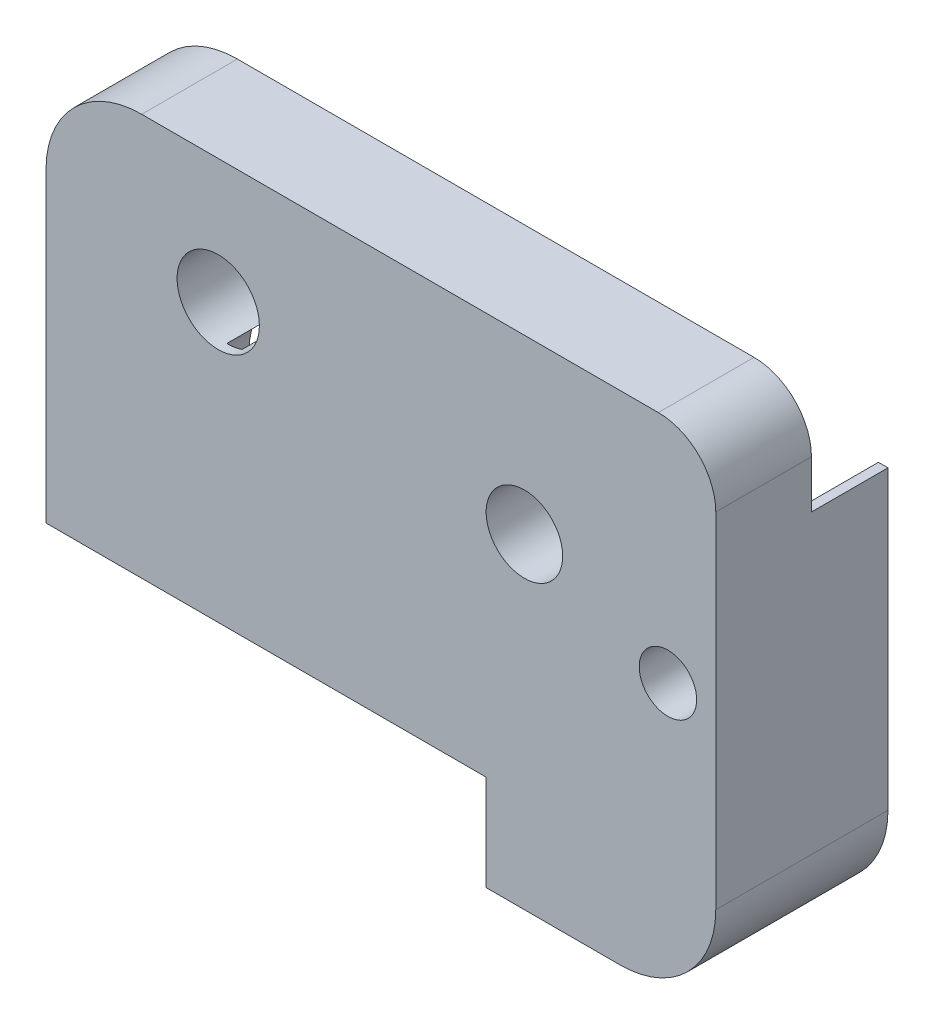
ISO-10303-21;
HEADER;
FILE_DESCRIPTION(('STEP AP214'),'2;1');
FILE_NAME('part.step','',(''),(''),'','','');
FILE_SCHEMA(('AUTOMOTIVE_DESIGN { 1 0 10303 214 1 1 1 1 }'));
ENDSEC;
DATA;
#1=APPLICATION_CONTEXT('core data for automotive mechanical design processes');
#2=APPLICATION_PROTOCOL_DEFINITION('international standard','automotive_design',2000,#1);
#3=PRODUCT_CONTEXT('',#1,'mechanical');
#4=PRODUCT('Part','Part','',(#3));
#5=PRODUCT_RELATED_PRODUCT_CATEGORY('part','',(#4));
#6=PRODUCT_DEFINITION_FORMATION('','',#4);
#7=PRODUCT_DEFINITION_CONTEXT('part definition',#1,'design');
#8=PRODUCT_DEFINITION('design','',#6,#7);
#9=PRODUCT_DEFINITION_SHAPE('','',#8);
#10=(LENGTH_UNIT() NAMED_UNIT(*) SI_UNIT(.MILLI.,.METRE.));
#11=(NAMED_UNIT(*) PLANE_ANGLE_UNIT() SI_UNIT($,.RADIAN.));
#12=(NAMED_UNIT(*) SI_UNIT($,.STERADIAN.) SOLID_ANGLE_UNIT());
#13=UNCERTAINTY_MEASURE_WITH_UNIT(LENGTH_MEASURE(1.E-05),#10,'distance_accuracy_value','');
#14=(GEOMETRIC_REPRESENTATION_CONTEXT(3) GLOBAL_UNCERTAINTY_ASSIGNED_CONTEXT((#13)) GLOBAL_UNIT_ASSIGNED_CONTEXT((#10,
#11,#12)) REPRESENTATION_CONTEXT('',''));
#15=CARTESIAN_POINT('',(0.,0.,0.));
#16=DIRECTION('',(0.,0.,1.));
#17=DIRECTION('',(1.,0.,0.));
#18=AXIS2_PLACEMENT_3D('',#15,#16,#17);
#19=CARTESIAN_POINT('',(-15.,-14.5,0.));
#20=DIRECTION('',(0.,0.,1.));
#21=DIRECTION('',(1.,0.,0.));
#22=AXIS2_PLACEMENT_3D('',#19,#20,#21);
#23=PLANE('',#22);
#24=CARTESIAN_POINT('',(17.5,-5.5,0.));
#25=DIRECTION('',(0.,0.,1.));
#26=DIRECTION('',(1.,0.,0.));
#27=AXIS2_PLACEMENT_3D('',#24,#25,#26);
#28=CIRCLE('',#27,2.);
#29=CARTESIAN_POINT('',(19.5,-5.5,0.));
#30=VERTEX_POINT('',#29);
#31=CARTESIAN_POINT('',(17.5,-7.5,0.));
#32=VERTEX_POINT('',#31);
#33=EDGE_CURVE('E220',#30,#32,#28,.F.);
#34=ORIENTED_EDGE('',*,*,#33,.T.);
#35=CARTESIAN_POINT('',(17.5,-5.5,0.));
#36=DIRECTION('',(0.,0.,1.));
#37=DIRECTION('',(1.,0.,0.));
#38=AXIS2_PLACEMENT_3D('',#35,#36,#37);
#39=CIRCLE('',#38,2.);
#40=CARTESIAN_POINT('',(15.5,-5.5,0.));
#41=VERTEX_POINT('',#40);
#42=EDGE_CURVE('E222',#32,#41,#39,.F.);
#43=ORIENTED_EDGE('',*,*,#42,.T.);
#44=DIRECTION('',(0.,1.,0.));
#45=VECTOR('',#44,1.);
#46=CARTESIAN_POINT('',(15.5,-7.5,0.));
#47=LINE('',#46,#45);
#48=CARTESIAN_POINT('',(15.5,-0.949192546583853,0.));
#49=VERTEX_POINT('',#48);
#50=EDGE_CURVE('E232',#41,#49,#47,.T.);
#51=ORIENTED_EDGE('',*,*,#50,.T.);
#52=DIRECTION('',(0.8001192566292,0.599840958230711,0.));
#53=VECTOR('',#52,1.);
#54=CARTESIAN_POINT('',(18.1,1.,0.));
#55=LINE('',#54,#53);
#56=CARTESIAN_POINT('',(2.,-11.07,0.));
#57=VERTEX_POINT('',#56);
#58=EDGE_CURVE('E202',#57,#49,#55,.T.);
#59=ORIENTED_EDGE('',*,*,#58,.F.);
#60=DIRECTION('',(0.,1.,0.));
#61=VECTOR('',#60,1.);
#62=CARTESIAN_POINT('',(2.,-11.07,0.));
#63=LINE('',#62,#61);
#64=CARTESIAN_POINT('',(2.,-14.5,0.));
#65=VERTEX_POINT('',#64);
#66=EDGE_CURVE('E206',#65,#57,#63,.T.);
#67=ORIENTED_EDGE('',*,*,#66,.F.);
#68=DIRECTION('',(1.,0.,0.));
#69=VECTOR('',#68,1.);
#70=CARTESIAN_POINT('',(-15.,-14.5,0.));
#71=LINE('',#70,#69);
#72=CARTESIAN_POINT('',(-15.,-14.5,0.));
#73=VERTEX_POINT('',#72);
#74=EDGE_CURVE('E268',#73,#65,#71,.T.);
#75=ORIENTED_EDGE('',*,*,#74,.F.);
#76=DIRECTION('',(0.,-1.,0.));
#77=VECTOR('',#76,1.);
#78=CARTESIAN_POINT('',(-15.,6.5,0.));
#79=LINE('',#78,#77);
#80=CARTESIAN_POINT('',(-15.,1.5,0.));
#81=VERTEX_POINT('',#80);
#82=EDGE_CURVE('E277',#81,#73,#79,.T.);
#83=ORIENTED_EDGE('',*,*,#82,.F.);
#84=CARTESIAN_POINT('',(-10.,1.5,0.));
#85=DIRECTION('',(0.,0.,1.));
#86=DIRECTION('',(1.,0.,0.));
#87=AXIS2_PLACEMENT_3D('',#84,#85,#86);
#88=CIRCLE('',#87,5.);
#89=CARTESIAN_POINT('',(-10.,6.5,0.));
#90=VERTEX_POINT('',#89);
#91=EDGE_CURVE('E305',#81,#90,#88,.F.);
#92=ORIENTED_EDGE('',*,*,#91,.T.);
#93=DIRECTION('',(-1.,0.,0.));
#94=VECTOR('',#93,1.);
#95=CARTESIAN_POINT('',(-15.,6.5,0.));
#96=LINE('',#95,#94);
#97=CARTESIAN_POINT('',(17.,6.5,0.));
#98=VERTEX_POINT('',#97);
#99=EDGE_CURVE('E276',#98,#90,#96,.T.);
#100=ORIENTED_EDGE('',*,*,#99,.F.);
#101=CARTESIAN_POINT('',(17.,3.5,0.));
#102=DIRECTION('',(0.,0.,1.));
#103=DIRECTION('',(1.,0.,0.));
#104=AXIS2_PLACEMENT_3D('',#101,#102,#103);
#105=CIRCLE('',#104,3.);
#106=CARTESIAN_POINT('',(20.,3.5,0.));
#107=VERTEX_POINT('',#106);
#108=EDGE_CURVE('E355',#98,#107,#105,.F.);
#109=ORIENTED_EDGE('',*,*,#108,.T.);
#110=DIRECTION('',(0.,-1.,0.));
#111=VECTOR('',#110,1.);
#112=CARTESIAN_POINT('',(20.,6.5,0.));
#113=LINE('',#112,#111);
#114=CARTESIAN_POINT('',(20.,1.,0.));
#115=VERTEX_POINT('',#114);
#116=EDGE_CURVE('E358',#107,#115,#113,.T.);
#117=ORIENTED_EDGE('',*,*,#116,.T.);
#118=DIRECTION('',(1.,0.,0.));
#119=VECTOR('',#118,1.);
#120=CARTESIAN_POINT('',(20.,1.,0.));
#121=LINE('',#120,#119);
#122=CARTESIAN_POINT('',(19.5,1.,0.));
#123=VERTEX_POINT('',#122);
#124=EDGE_CURVE('E205',#123,#115,#121,.T.);
#125=ORIENTED_EDGE('',*,*,#124,.F.);
#126=DIRECTION('',(0.,-1.,0.));
#127=VECTOR('',#126,1.);
#128=CARTESIAN_POINT('',(19.5,1.,0.));
#129=LINE('',#128,#127);
#130=EDGE_CURVE('E174',#123,#30,#129,.T.);
#131=ORIENTED_EDGE('',*,*,#130,.T.);
#132=EDGE_LOOP('',(#34,#43,#51,#59,#67,#75,#83,#92,#100,#109,#117,#125,#131));
#133=FACE_BOUND('',#132,.T.);
#134=CARTESIAN_POINT('',(-4.9,-6.5,0.));
#135=DIRECTION('',(0.,0.,-1.));
#136=DIRECTION('',(-1.,0.,0.));
#137=AXIS2_PLACEMENT_3D('',#134,#135,#136);
#138=CIRCLE('',#137,4.5);
#139=CARTESIAN_POINT('',(-9.4,-6.5,0.));
#140=VERTEX_POINT('',#139);
#141=EDGE_CURVE('E380',#140,#140,#138,.T.);
#142=ORIENTED_EDGE('',*,*,#141,.F.);
#143=EDGE_LOOP('',(#142));
#144=FACE_BOUND('',#143,.T.);
#145=CARTESIAN_POINT('',(17.5,-5.5,0.));
#146=DIRECTION('',(0.,0.,1.));
#147=DIRECTION('',(1.,0.,0.));
#148=AXIS2_PLACEMENT_3D('',#145,#146,#147);
#149=CIRCLE('',#148,1.5);
#150=CARTESIAN_POINT('',(19.,-5.5,0.));
#151=VERTEX_POINT('',#150);
#152=EDGE_CURVE('E178',#151,#151,#149,.F.);
#153=ORIENTED_EDGE('',*,*,#152,.F.);
#154=EDGE_LOOP('',(#153));
#155=FACE_BOUND('',#154,.T.);
#156=ADVANCED_FACE('F36',(#133,#144,#155),#23,.F.);
#157=CARTESIAN_POINT('',(-15.,6.5,5.));
#158=DIRECTION('',(1.,0.,0.));
#159=DIRECTION('',(0.,1.,0.));
#160=AXIS2_PLACEMENT_3D('',#157,#158,#159);
#161=PLANE('',#160);
#162=DIRECTION('',(0.,-1.,0.));
#163=VECTOR('',#162,1.);
#164=CARTESIAN_POINT('',(-15.,6.5,5.));
#165=LINE('',#164,#163);
#166=CARTESIAN_POINT('',(-15.,1.5,5.));
#167=VERTEX_POINT('',#166);
#168=CARTESIAN_POINT('',(-15.,-14.5,5.));
#169=VERTEX_POINT('',#168);
#170=EDGE_CURVE('E330',#167,#169,#165,.T.);
#171=ORIENTED_EDGE('',*,*,#170,.F.);
#172=DIRECTION('',(0.,0.,-1.));
#173=VECTOR('',#172,1.);
#174=CARTESIAN_POINT('',(-15.,1.5,5.));
#175=LINE('',#174,#173);
#176=EDGE_CURVE('E303',#167,#81,#175,.T.);
#177=ORIENTED_EDGE('',*,*,#176,.T.);
#178=ORIENTED_EDGE('',*,*,#82,.T.);
#179=DIRECTION('',(0.,0.,-1.));
#180=VECTOR('',#179,1.);
#181=CARTESIAN_POINT('',(-15.,-14.5,5.));
#182=LINE('',#181,#180);
#183=EDGE_CURVE('E275',#169,#73,#182,.T.);
#184=ORIENTED_EDGE('',*,*,#183,.F.);
#185=EDGE_LOOP('',(#171,#177,#178,#184));
#186=FACE_BOUND('',#185,.T.);
#187=ADVANCED_FACE('F329',(#186),#161,.F.);
#188=CARTESIAN_POINT('',(-15.,-14.5,5.));
#189=DIRECTION('',(0.,1.,0.));
#190=DIRECTION('',(0.,0.,1.));
#191=AXIS2_PLACEMENT_3D('',#188,#189,#190);
#192=PLANE('',#191);
#193=CARTESIAN_POINT('',(1.40000000000001,-14.5,2.5));
#194=DIRECTION('',(0.,-1.,0.));
#195=DIRECTION('',(0.,0.,-1.));
#196=AXIS2_PLACEMENT_3D('',#193,#194,#195);
#197=CIRCLE('',#196,1.25);
#198=CARTESIAN_POINT('',(1.40000000000001,-14.5,1.25));
#199=VERTEX_POINT('',#198);
#200=EDGE_CURVE('E360',#199,#199,#197,.T.);
#201=ORIENTED_EDGE('',*,*,#200,.F.);
#202=EDGE_LOOP('',(#201));
#203=FACE_BOUND('',#202,.T.);
#204=CARTESIAN_POINT('',(-12.,-14.5,2.5));
#205=DIRECTION('',(0.,-1.,0.));
#206=DIRECTION('',(0.,0.,-1.));
#207=AXIS2_PLACEMENT_3D('',#204,#205,#206);
#208=CIRCLE('',#207,1.25);
#209=CARTESIAN_POINT('',(-12.,-14.5,1.25));
#210=VERTEX_POINT('',#209);
#211=EDGE_CURVE('E377',#210,#210,#208,.T.);
#212=ORIENTED_EDGE('',*,*,#211,.F.);
#213=EDGE_LOOP('',(#212));
#214=FACE_BOUND('',#213,.T.);
#215=ORIENTED_EDGE('',*,*,#74,.T.);
#216=DIRECTION('',(0.,0.,1.));
#217=VECTOR('',#216,1.);
#218=CARTESIAN_POINT('',(2.,-14.5,-4.));
#219=LINE('',#218,#217);
#220=CARTESIAN_POINT('',(2.,-14.5,-4.));
#221=VERTEX_POINT('',#220);
#222=EDGE_CURVE('E263',#221,#65,#219,.T.);
#223=ORIENTED_EDGE('',*,*,#222,.F.);
#224=DIRECTION('',(-1.,0.,0.));
#225=VECTOR('',#224,1.);
#226=CARTESIAN_POINT('',(2.,-14.5,-4.));
#227=LINE('',#226,#225);
#228=CARTESIAN_POINT('',(8.,-14.5,-4.));
#229=VERTEX_POINT('',#228);
#230=EDGE_CURVE('E251',#229,#221,#227,.T.);
#231=ORIENTED_EDGE('',*,*,#230,.F.);
#232=DIRECTION('',(0.,0.,-1.));
#233=VECTOR('',#232,1.);
#234=CARTESIAN_POINT('',(8.00000000000001,-14.5,5.));
#235=LINE('',#234,#233);
#236=CARTESIAN_POINT('',(8.00000000000001,-14.5,5.));
#237=VERTEX_POINT('',#236);
#238=EDGE_CURVE('E323',#237,#229,#235,.T.);
#239=ORIENTED_EDGE('',*,*,#238,.F.);
#240=DIRECTION('',(1.,0.,0.));
#241=VECTOR('',#240,1.);
#242=CARTESIAN_POINT('',(-15.,-14.5,5.));
#243=LINE('',#242,#241);
#244=EDGE_CURVE('E324',#169,#237,#243,.T.);
#245=ORIENTED_EDGE('',*,*,#244,.F.);
#246=ORIENTED_EDGE('',*,*,#183,.T.);
#247=EDGE_LOOP('',(#215,#223,#231,#239,#245,#246));
#248=FACE_BOUND('',#247,.T.);
#249=ADVANCED_FACE('F272',(#203,#214,#248),#192,.F.);
#250=CARTESIAN_POINT('',(-15.,6.5,5.));
#251=DIRECTION('',(0.,-1.,0.));
#252=DIRECTION('',(0.,0.,-1.));
#253=AXIS2_PLACEMENT_3D('',#250,#251,#252);
#254=PLANE('',#253);
#255=ORIENTED_EDGE('',*,*,#99,.T.);
#256=DIRECTION('',(0.,0.,-1.));
#257=VECTOR('',#256,1.);
#258=CARTESIAN_POINT('',(-10.,6.5,5.));
#259=LINE('',#258,#257);
#260=CARTESIAN_POINT('',(-10.,6.5,5.));
#261=VERTEX_POINT('',#260);
#262=EDGE_CURVE('E215',#90,#261,#259,.F.);
#263=ORIENTED_EDGE('',*,*,#262,.T.);
#264=DIRECTION('',(-1.,0.,0.));
#265=VECTOR('',#264,1.);
#266=CARTESIAN_POINT('',(-15.,6.5,5.));
#267=LINE('',#266,#265);
#268=CARTESIAN_POINT('',(17.,6.5,5.));
#269=VERTEX_POINT('',#268);
#270=EDGE_CURVE('E313',#269,#261,#267,.T.);
#271=ORIENTED_EDGE('',*,*,#270,.F.);
#272=DIRECTION('',(0.,0.,1.));
#273=VECTOR('',#272,1.);
#274=CARTESIAN_POINT('',(17.,6.5,0.));
#275=LINE('',#274,#273);
#276=EDGE_CURVE('E295',#269,#98,#275,.F.);
#277=ORIENTED_EDGE('',*,*,#276,.T.);
#278=EDGE_LOOP('',(#255,#263,#271,#277));
#279=FACE_BOUND('',#278,.T.);
#280=ADVANCED_FACE('F312',(#279),#254,.F.);
#281=CARTESIAN_POINT('',(-15.,-14.5,5.));
#282=DIRECTION('',(0.,0.,1.));
#283=DIRECTION('',(1.,0.,0.));
#284=AXIS2_PLACEMENT_3D('',#281,#282,#283);
#285=PLANE('',#284);
#286=CARTESIAN_POINT('',(10.,-2.5,5.));
#287=DIRECTION('',(0.,0.,1.));
#288=DIRECTION('',(1.,0.,0.));
#289=AXIS2_PLACEMENT_3D('',#286,#287,#288);
#290=CIRCLE('',#289,2.);
#291=CARTESIAN_POINT('',(12.,-2.5,5.));
#292=VERTEX_POINT('',#291);
#293=EDGE_CURVE('E513',#292,#292,#290,.T.);
#294=ORIENTED_EDGE('',*,*,#293,.F.);
#295=EDGE_LOOP('',(#294));
#296=FACE_BOUND('',#295,.T.);
#297=CARTESIAN_POINT('',(17.5,-5.5,5.));
#298=DIRECTION('',(0.,0.,1.));
#299=DIRECTION('',(1.,0.,0.));
#300=AXIS2_PLACEMENT_3D('',#297,#298,#299);
#301=CIRCLE('',#300,1.5);
#302=CARTESIAN_POINT('',(19.,-5.5,5.));
#303=VERTEX_POINT('',#302);
#304=EDGE_CURVE('E365',#303,#303,#301,.T.);
#305=ORIENTED_EDGE('',*,*,#304,.F.);
#306=EDGE_LOOP('',(#305));
#307=FACE_BOUND('',#306,.T.);
#308=CARTESIAN_POINT('',(-6.,0.,5.));
#309=DIRECTION('',(0.,0.,1.));
#310=DIRECTION('',(1.,0.,0.));
#311=AXIS2_PLACEMENT_3D('',#308,#309,#310);
#312=CIRCLE('',#311,2.15);
#313=CARTESIAN_POINT('',(-3.85,0.,5.));
#314=VERTEX_POINT('',#313);
#315=EDGE_CURVE('E334',#314,#314,#312,.T.);
#316=ORIENTED_EDGE('',*,*,#315,.F.);
#317=EDGE_LOOP('',(#316));
#318=FACE_BOUND('',#317,.T.);
#319=DIRECTION('',(1.,0.,0.));
#320=VECTOR('',#319,1.);
#321=CARTESIAN_POINT('',(8.,-19.5,5.));
#322=LINE('',#321,#320);
#323=CARTESIAN_POINT('',(8.,-19.5,5.));
#324=VERTEX_POINT('',#323);
#325=CARTESIAN_POINT('',(15.,-19.5,5.));
#326=VERTEX_POINT('',#325);
#327=EDGE_CURVE('E369',#324,#326,#322,.T.);
#328=ORIENTED_EDGE('',*,*,#327,.T.);
#329=CARTESIAN_POINT('',(15.,-14.5,5.));
#330=DIRECTION('',(0.,0.,1.));
#331=DIRECTION('',(1.,0.,0.));
#332=AXIS2_PLACEMENT_3D('',#329,#330,#331);
#333=CIRCLE('',#332,5.);
#334=CARTESIAN_POINT('',(20.,-14.5,5.));
#335=VERTEX_POINT('',#334);
#336=EDGE_CURVE('E297',#326,#335,#333,.T.);
#337=ORIENTED_EDGE('',*,*,#336,.T.);
#338=DIRECTION('',(0.,1.,0.));
#339=VECTOR('',#338,1.);
#340=CARTESIAN_POINT('',(20.,6.5,5.));
#341=LINE('',#340,#339);
#342=CARTESIAN_POINT('',(20.,3.5,5.));
#343=VERTEX_POINT('',#342);
#344=EDGE_CURVE('E739',#335,#343,#341,.T.);
#345=ORIENTED_EDGE('',*,*,#344,.T.);
#346=CARTESIAN_POINT('',(17.,3.5,5.));
#347=DIRECTION('',(0.,0.,1.));
#348=DIRECTION('',(1.,0.,0.));
#349=AXIS2_PLACEMENT_3D('',#346,#347,#348);
#350=CIRCLE('',#349,3.);
#351=EDGE_CURVE('E322',#343,#269,#350,.T.);
#352=ORIENTED_EDGE('',*,*,#351,.T.);
#353=ORIENTED_EDGE('',*,*,#270,.T.);
#354=CARTESIAN_POINT('',(-10.,1.5,5.));
#355=DIRECTION('',(0.,0.,1.));
#356=DIRECTION('',(1.,0.,0.));
#357=AXIS2_PLACEMENT_3D('',#354,#355,#356);
#358=CIRCLE('',#357,5.);
#359=EDGE_CURVE('E294',#261,#167,#358,.T.);
#360=ORIENTED_EDGE('',*,*,#359,.T.);
#361=ORIENTED_EDGE('',*,*,#170,.T.);
#362=ORIENTED_EDGE('',*,*,#244,.T.);
#363=DIRECTION('',(0.,-1.,0.));
#364=VECTOR('',#363,1.);
#365=CARTESIAN_POINT('',(8.,6.5,5.));
#366=LINE('',#365,#364);
#367=EDGE_CURVE('E372',#237,#324,#366,.T.);
#368=ORIENTED_EDGE('',*,*,#367,.T.);
#369=EDGE_LOOP('',(#328,#337,#345,#352,#353,#360,#361,#362,#368));
#370=FACE_BOUND('',#369,.T.);
#371=ADVANCED_FACE('F319',(#296,#307,#318,#370),#285,.T.);
#372=CARTESIAN_POINT('',(-6.,0.,0.7));
#373=DIRECTION('',(0.,0.,1.));
#374=DIRECTION('',(1.,0.,0.));
#375=AXIS2_PLACEMENT_3D('',#372,#373,#374);
#376=CYLINDRICAL_SURFACE('',#375,2.15);
#377=CARTESIAN_POINT('',(-6.,0.,0.7));
#378=DIRECTION('',(0.,0.,1.));
#379=DIRECTION('',(1.,0.,0.));
#380=AXIS2_PLACEMENT_3D('',#377,#378,#379);
#381=CIRCLE('',#380,2.15);
#382=CARTESIAN_POINT('',(-5.24556552019208,-2.01328801110943,0.7));
#383=VERTEX_POINT('',#382);
#384=CARTESIAN_POINT('',(-6.0499763573965,-2.1494190758671,0.7));
#385=VERTEX_POINT('',#384);
#386=EDGE_CURVE('E331',#383,#385,#381,.T.);
#387=ORIENTED_EDGE('',*,*,#386,.F.);
#388=DIRECTION('',(0.,0.,-1.));
#389=VECTOR('',#388,1.);
#390=CARTESIAN_POINT('',(-5.24556552019208,-2.01328801110943,2.25));
#391=LINE('',#390,#389);
#392=CARTESIAN_POINT('',(-5.24556552019209,-2.01328801110943,4.5));
#393=VERTEX_POINT('',#392);
#394=EDGE_CURVE('E389',#383,#393,#391,.F.);
#395=ORIENTED_EDGE('',*,*,#394,.T.);
#396=CARTESIAN_POINT('',(-6.,0.,4.5));
#397=DIRECTION('',(0.,0.,-1.));
#398=DIRECTION('',(-1.,0.,0.));
#399=AXIS2_PLACEMENT_3D('',#396,#397,#398);
#400=CIRCLE('',#399,2.15);
#401=CARTESIAN_POINT('',(-6.0499763573965,-2.1494190758671,4.5));
#402=VERTEX_POINT('',#401);
#403=EDGE_CURVE('E344',#402,#393,#400,.F.);
#404=ORIENTED_EDGE('',*,*,#403,.F.);
#405=DIRECTION('',(0.,0.,-1.));
#406=VECTOR('',#405,1.);
#407=CARTESIAN_POINT('',(-6.0499763573965,-2.1494190758671,2.25));
#408=LINE('',#407,#406);
#409=EDGE_CURVE('E384',#402,#385,#408,.T.);
#410=ORIENTED_EDGE('',*,*,#409,.T.);
#411=EDGE_LOOP('',(#387,#395,#404,#410));
#412=FACE_BOUND('',#411,.T.);
#413=ORIENTED_EDGE('',*,*,#315,.T.);
#414=EDGE_LOOP('',(#413));
#415=FACE_BOUND('',#414,.T.);
#416=ADVANCED_FACE('F405',(#412,#415),#376,.F.);
#417=CARTESIAN_POINT('',(-6.,0.,0.7));
#418=DIRECTION('',(0.,0.,1.));
#419=DIRECTION('',(1.,0.,0.));
#420=AXIS2_PLACEMENT_3D('',#417,#418,#419);
#421=PLANE('',#420);
#422=CARTESIAN_POINT('',(-4.9,-6.5,0.7));
#423=DIRECTION('',(0.,0.,1.));
#424=DIRECTION('',(1.,0.,0.));
#425=AXIS2_PLACEMENT_3D('',#422,#423,#424);
#426=CIRCLE('',#425,4.5);
#427=EDGE_CURVE('E395',#383,#385,#426,.T.);
#428=ORIENTED_EDGE('',*,*,#427,.F.);
#429=ORIENTED_EDGE('',*,*,#386,.T.);
#430=EDGE_LOOP('',(#428,#429));
#431=FACE_BOUND('',#430,.T.);
#432=ADVANCED_FACE('F408',(#431),#421,.T.);
#433=CARTESIAN_POINT('',(-4.9,-6.5,4.5));
#434=DIRECTION('',(0.,0.,-1.));
#435=DIRECTION('',(-1.,0.,0.));
#436=AXIS2_PLACEMENT_3D('',#433,#434,#435);
#437=PLANE('',#436);
#438=ORIENTED_EDGE('',*,*,#403,.T.);
#439=CARTESIAN_POINT('',(-4.9,-6.5,4.5));
#440=DIRECTION('',(0.,0.,-1.));
#441=DIRECTION('',(-1.,0.,0.));
#442=AXIS2_PLACEMENT_3D('',#439,#440,#441);
#443=CIRCLE('',#442,4.5);
#444=EDGE_CURVE('E381',#393,#402,#443,.T.);
#445=ORIENTED_EDGE('',*,*,#444,.T.);
#446=EDGE_LOOP('',(#438,#445));
#447=FACE_BOUND('',#446,.T.);
#448=ADVANCED_FACE('F401',(#447),#437,.T.);
#449=CARTESIAN_POINT('',(-4.9,-6.5,4.5));
#450=DIRECTION('',(0.,0.,-1.));
#451=DIRECTION('',(-1.,0.,0.));
#452=AXIS2_PLACEMENT_3D('',#449,#450,#451);
#453=CYLINDRICAL_SURFACE('',#452,4.5);
#454=ORIENTED_EDGE('',*,*,#141,.T.);
#455=EDGE_LOOP('',(#454));
#456=FACE_BOUND('',#455,.T.);
#457=ORIENTED_EDGE('',*,*,#427,.T.);
#458=ORIENTED_EDGE('',*,*,#409,.F.);
#459=ORIENTED_EDGE('',*,*,#444,.F.);
#460=ORIENTED_EDGE('',*,*,#394,.F.);
#461=EDGE_LOOP('',(#457,#458,#459,#460));
#462=FACE_BOUND('',#461,.T.);
#463=ADVANCED_FACE('F403',(#456,#462),#453,.F.);
#464=CARTESIAN_POINT('',(-12.,-6.5,2.5));
#465=DIRECTION('',(0.,-1.,0.));
#466=DIRECTION('',(0.,0.,-1.));
#467=AXIS2_PLACEMENT_3D('',#464,#465,#466);
#468=CYLINDRICAL_SURFACE('',#467,1.25);
#469=CARTESIAN_POINT('',(-12.,-6.50000000000001,2.5));
#470=DIRECTION('',(0.,-1.,0.));
#471=DIRECTION('',(0.,0.,-1.));
#472=AXIS2_PLACEMENT_3D('',#469,#470,#471);
#473=CIRCLE('',#472,1.24999999999999);
#474=CARTESIAN_POINT('',(-12.,-6.50000000000001,1.25000000000001));
#475=VERTEX_POINT('',#474);
#476=EDGE_CURVE('E279',#475,#475,#473,.T.);
#477=ORIENTED_EDGE('',*,*,#476,.F.);
#478=EDGE_LOOP('',(#477));
#479=FACE_BOUND('',#478,.T.);
#480=ORIENTED_EDGE('',*,*,#211,.T.);
#481=EDGE_LOOP('',(#480));
#482=FACE_BOUND('',#481,.T.);
#483=ADVANCED_FACE('F496',(#479,#482),#468,.F.);
#484=CARTESIAN_POINT('',(1.40000000000001,-6.5,2.5));
#485=DIRECTION('',(0.,-1.,0.));
#486=DIRECTION('',(0.,0.,-1.));
#487=AXIS2_PLACEMENT_3D('',#484,#485,#486);
#488=CYLINDRICAL_SURFACE('',#487,1.25);
#489=CARTESIAN_POINT('',(1.40000000000001,-6.50000000000001,2.5));
#490=DIRECTION('',(0.,-1.,0.));
#491=DIRECTION('',(0.,0.,-1.));
#492=AXIS2_PLACEMENT_3D('',#489,#490,#491);
#493=CIRCLE('',#492,1.24999999999999);
#494=CARTESIAN_POINT('',(1.40000000000001,-6.50000000000001,1.25000000000001));
#495=VERTEX_POINT('',#494);
#496=EDGE_CURVE('E282',#495,#495,#493,.T.);
#497=ORIENTED_EDGE('',*,*,#496,.F.);
#498=EDGE_LOOP('',(#497));
#499=FACE_BOUND('',#498,.T.);
#500=ORIENTED_EDGE('',*,*,#200,.T.);
#501=EDGE_LOOP('',(#500));
#502=FACE_BOUND('',#501,.T.);
#503=ADVANCED_FACE('F492',(#499,#502),#488,.F.);
#504=CARTESIAN_POINT('',(8.,6.5,-28.6356421265527));
#505=DIRECTION('',(-1.,0.,0.));
#506=DIRECTION('',(0.,-1.,0.));
#507=AXIS2_PLACEMENT_3D('',#504,#505,#506);
#508=PLANE('',#507);
#509=ORIENTED_EDGE('',*,*,#367,.F.);
#510=ORIENTED_EDGE('',*,*,#238,.T.);
#511=DIRECTION('',(0.,1.,0.));
#512=VECTOR('',#511,1.);
#513=CARTESIAN_POINT('',(8.,-14.5,-4.));
#514=LINE('',#513,#512);
#515=CARTESIAN_POINT('',(8.,-19.5,-4.));
#516=VERTEX_POINT('',#515);
#517=EDGE_CURVE('E214',#516,#229,#514,.T.);
#518=ORIENTED_EDGE('',*,*,#517,.F.);
#519=DIRECTION('',(0.,0.,1.));
#520=VECTOR('',#519,1.);
#521=CARTESIAN_POINT('',(8.,-19.5,-28.6356421265527));
#522=LINE('',#521,#520);
#523=EDGE_CURVE('E361',#516,#324,#522,.T.);
#524=ORIENTED_EDGE('',*,*,#523,.T.);
#525=EDGE_LOOP('',(#509,#510,#518,#524));
#526=FACE_BOUND('',#525,.T.);
#527=ADVANCED_FACE('F485',(#526),#508,.T.);
#528=CARTESIAN_POINT('',(20.,6.5,-28.6356421265527));
#529=DIRECTION('',(1.,0.,0.));
#530=DIRECTION('',(0.,1.,0.));
#531=AXIS2_PLACEMENT_3D('',#528,#529,#530);
#532=PLANE('',#531);
#533=ORIENTED_EDGE('',*,*,#344,.F.);
#534=DIRECTION('',(0.,0.,1.));
#535=VECTOR('',#534,1.);
#536=CARTESIAN_POINT('',(20.,-14.5,-28.6356421265527));
#537=LINE('',#536,#535);
#538=CARTESIAN_POINT('',(20.,-14.5,-4.));
#539=VERTEX_POINT('',#538);
#540=EDGE_CURVE('E299',#335,#539,#537,.F.);
#541=ORIENTED_EDGE('',*,*,#540,.T.);
#542=DIRECTION('',(0.,-1.,0.));
#543=VECTOR('',#542,1.);
#544=CARTESIAN_POINT('',(20.,-19.5,-4.));
#545=LINE('',#544,#543);
#546=CARTESIAN_POINT('',(20.,1.,-4.));
#547=VERTEX_POINT('',#546);
#548=EDGE_CURVE('E191',#547,#539,#545,.T.);
#549=ORIENTED_EDGE('',*,*,#548,.F.);
#550=DIRECTION('',(0.,0.,1.));
#551=VECTOR('',#550,1.);
#552=CARTESIAN_POINT('',(20.,1.,-4.));
#553=LINE('',#552,#551);
#554=EDGE_CURVE('E189',#547,#115,#553,.T.);
#555=ORIENTED_EDGE('',*,*,#554,.T.);
#556=ORIENTED_EDGE('',*,*,#116,.F.);
#557=DIRECTION('',(0.,0.,1.));
#558=VECTOR('',#557,1.);
#559=CARTESIAN_POINT('',(20.,3.5,5.));
#560=LINE('',#559,#558);
#561=EDGE_CURVE('E352',#107,#343,#560,.T.);
#562=ORIENTED_EDGE('',*,*,#561,.T.);
#563=EDGE_LOOP('',(#533,#541,#549,#555,#556,#562));
#564=FACE_BOUND('',#563,.T.);
#565=ADVANCED_FACE('F482',(#564),#532,.T.);
#566=CARTESIAN_POINT('',(8.,-19.5,-28.6356421265527));
#567=DIRECTION('',(0.,-1.,0.));
#568=DIRECTION('',(0.,0.,-1.));
#569=AXIS2_PLACEMENT_3D('',#566,#567,#568);
#570=PLANE('',#569);
#571=DIRECTION('',(-1.,0.,0.));
#572=VECTOR('',#571,1.);
#573=CARTESIAN_POINT('',(8.,-19.5,-4.));
#574=LINE('',#573,#572);
#575=CARTESIAN_POINT('',(15.,-19.5,-4.));
#576=VERTEX_POINT('',#575);
#577=EDGE_CURVE('E194',#576,#516,#574,.T.);
#578=ORIENTED_EDGE('',*,*,#577,.F.);
#579=DIRECTION('',(0.,0.,1.));
#580=VECTOR('',#579,1.);
#581=CARTESIAN_POINT('',(15.,-19.5,-28.6356421265527));
#582=LINE('',#581,#580);
#583=EDGE_CURVE('E291',#576,#326,#582,.T.);
#584=ORIENTED_EDGE('',*,*,#583,.T.);
#585=ORIENTED_EDGE('',*,*,#327,.F.);
#586=ORIENTED_EDGE('',*,*,#523,.F.);
#587=EDGE_LOOP('',(#578,#584,#585,#586));
#588=FACE_BOUND('',#587,.T.);
#589=ADVANCED_FACE('F480',(#588),#570,.T.);
#590=CARTESIAN_POINT('',(17.5,-5.5,-4.24264068711929));
#591=DIRECTION('',(0.,0.,1.));
#592=DIRECTION('',(1.,0.,0.));
#593=AXIS2_PLACEMENT_3D('',#590,#591,#592);
#594=CYLINDRICAL_SURFACE('',#593,1.5);
#595=ORIENTED_EDGE('',*,*,#152,.T.);
#596=EDGE_LOOP('',(#595));
#597=FACE_BOUND('',#596,.T.);
#598=ORIENTED_EDGE('',*,*,#304,.T.);
#599=EDGE_LOOP('',(#598));
#600=FACE_BOUND('',#599,.T.);
#601=ADVANCED_FACE('F476',(#597,#600),#594,.F.);
#602=CARTESIAN_POINT('',(10.,-2.5,1.));
#603=DIRECTION('',(0.,0.,1.));
#604=DIRECTION('',(1.,0.,0.));
#605=AXIS2_PLACEMENT_3D('',#602,#603,#604);
#606=CYLINDRICAL_SURFACE('',#605,2.);
#607=CARTESIAN_POINT('',(10.,-2.5,1.));
#608=DIRECTION('',(0.,0.,1.));
#609=DIRECTION('',(1.,0.,0.));
#610=AXIS2_PLACEMENT_3D('',#607,#608,#609);
#611=CIRCLE('',#610,2.);
#612=CARTESIAN_POINT('',(12.,-2.5,1.));
#613=VERTEX_POINT('',#612);
#614=EDGE_CURVE('E511',#613,#613,#611,.T.);
#615=ORIENTED_EDGE('',*,*,#614,.F.);
#616=EDGE_LOOP('',(#615));
#617=FACE_BOUND('',#616,.T.);
#618=ORIENTED_EDGE('',*,*,#293,.T.);
#619=EDGE_LOOP('',(#618));
#620=FACE_BOUND('',#619,.T.);
#621=ADVANCED_FACE('F472',(#617,#620),#606,.F.);
#622=CARTESIAN_POINT('',(10.,-2.5,1.));
#623=DIRECTION('',(0.,0.,1.));
#624=DIRECTION('',(1.,0.,0.));
#625=AXIS2_PLACEMENT_3D('',#622,#623,#624);
#626=PLANE('',#625);
#627=ORIENTED_EDGE('',*,*,#614,.T.);
#628=EDGE_LOOP('',(#627));
#629=FACE_BOUND('',#628,.T.);
#630=ADVANCED_FACE('F435',(#629),#626,.T.);
#631=CARTESIAN_POINT('',(17.,3.5,-28.6356421265527));
#632=DIRECTION('',(0.,0.,-1.));
#633=DIRECTION('',(-1.,0.,0.));
#634=AXIS2_PLACEMENT_3D('',#631,#632,#633);
#635=CYLINDRICAL_SURFACE('',#634,3.);
#636=ORIENTED_EDGE('',*,*,#108,.F.);
#637=ORIENTED_EDGE('',*,*,#276,.F.);
#638=ORIENTED_EDGE('',*,*,#351,.F.);
#639=ORIENTED_EDGE('',*,*,#561,.F.);
#640=EDGE_LOOP('',(#636,#637,#638,#639));
#641=FACE_BOUND('',#640,.T.);
#642=ADVANCED_FACE('F431',(#641),#635,.T.);
#643=CARTESIAN_POINT('',(1.40000000000001,-6.50000000000001,2.5));
#644=DIRECTION('',(0.,-1.,0.));
#645=DIRECTION('',(0.,0.,-1.));
#646=AXIS2_PLACEMENT_3D('',#643,#644,#645);
#647=CONICAL_SURFACE('',#646,1.24999999999999,1.02974425867664);
#648=CARTESIAN_POINT('',(1.4,-5.74892422621555,2.5));
#649=VERTEX_POINT('',#648);
#650=VERTEX_LOOP('',#649);
#651=FACE_BOUND('',#650,.T.);
#652=ORIENTED_EDGE('',*,*,#496,.T.);
#653=EDGE_LOOP('',(#652));
#654=FACE_BOUND('',#653,.T.);
#655=ADVANCED_FACE('F434',(#651,#654),#647,.F.);
#656=CARTESIAN_POINT('',(-12.,-6.50000000000001,2.5));
#657=DIRECTION('',(0.,-1.,0.));
#658=DIRECTION('',(0.,0.,-1.));
#659=AXIS2_PLACEMENT_3D('',#656,#657,#658);
#660=CONICAL_SURFACE('',#659,1.24999999999999,1.02974425867664);
#661=CARTESIAN_POINT('',(-12.,-5.74892422621555,2.5));
#662=VERTEX_POINT('',#661);
#663=VERTEX_LOOP('',#662);
#664=FACE_BOUND('',#663,.T.);
#665=ORIENTED_EDGE('',*,*,#476,.T.);
#666=EDGE_LOOP('',(#665));
#667=FACE_BOUND('',#666,.T.);
#668=ADVANCED_FACE('F457',(#664,#667),#660,.F.);
#669=CARTESIAN_POINT('',(8.,-19.5,-4.));
#670=DIRECTION('',(0.,0.,1.));
#671=DIRECTION('',(1.,0.,0.));
#672=AXIS2_PLACEMENT_3D('',#669,#670,#671);
#673=PLANE('',#672);
#674=CARTESIAN_POINT('',(17.5,-5.5,-4.));
#675=DIRECTION('',(0.,0.,1.));
#676=DIRECTION('',(1.,0.,0.));
#677=AXIS2_PLACEMENT_3D('',#674,#675,#676);
#678=CIRCLE('',#677,2.);
#679=CARTESIAN_POINT('',(15.5,-5.5,-4.));
#680=VERTEX_POINT('',#679);
#681=CARTESIAN_POINT('',(17.5,-7.5,-4.));
#682=VERTEX_POINT('',#681);
#683=EDGE_CURVE('E45',#680,#682,#678,.T.);
#684=ORIENTED_EDGE('',*,*,#683,.T.);
#685=CARTESIAN_POINT('',(17.5,-5.5,-4.));
#686=DIRECTION('',(0.,0.,1.));
#687=DIRECTION('',(1.,0.,0.));
#688=AXIS2_PLACEMENT_3D('',#685,#686,#687);
#689=CIRCLE('',#688,2.);
#690=CARTESIAN_POINT('',(19.5,-5.5,-4.));
#691=VERTEX_POINT('',#690);
#692=EDGE_CURVE('E11',#682,#691,#689,.T.);
#693=ORIENTED_EDGE('',*,*,#692,.T.);
#694=DIRECTION('',(0.,-1.,0.));
#695=VECTOR('',#694,1.);
#696=CARTESIAN_POINT('',(19.5,1.,-4.));
#697=LINE('',#696,#695);
#698=CARTESIAN_POINT('',(19.5,1.,-4.));
#699=VERTEX_POINT('',#698);
#700=EDGE_CURVE('E171',#699,#691,#697,.T.);
#701=ORIENTED_EDGE('',*,*,#700,.F.);
#702=DIRECTION('',(1.,0.,0.));
#703=VECTOR('',#702,1.);
#704=CARTESIAN_POINT('',(20.,1.,-4.));
#705=LINE('',#704,#703);
#706=EDGE_CURVE('E183',#699,#547,#705,.T.);
#707=ORIENTED_EDGE('',*,*,#706,.T.);
#708=ORIENTED_EDGE('',*,*,#548,.T.);
#709=CARTESIAN_POINT('',(15.,-14.5,-4.));
#710=DIRECTION('',(0.,0.,1.));
#711=DIRECTION('',(1.,0.,0.));
#712=AXIS2_PLACEMENT_3D('',#709,#710,#711);
#713=CIRCLE('',#712,5.);
#714=EDGE_CURVE('E301',#539,#576,#713,.F.);
#715=ORIENTED_EDGE('',*,*,#714,.T.);
#716=ORIENTED_EDGE('',*,*,#577,.T.);
#717=ORIENTED_EDGE('',*,*,#517,.T.);
#718=ORIENTED_EDGE('',*,*,#230,.T.);
#719=DIRECTION('',(0.,1.,0.));
#720=VECTOR('',#719,1.);
#721=CARTESIAN_POINT('',(2.,-11.07,-4.));
#722=LINE('',#721,#720);
#723=CARTESIAN_POINT('',(2.,-11.07,-4.));
#724=VERTEX_POINT('',#723);
#725=EDGE_CURVE('E197',#221,#724,#722,.T.);
#726=ORIENTED_EDGE('',*,*,#725,.T.);
#727=DIRECTION('',(0.8001192566292,0.599840958230711,0.));
#728=VECTOR('',#727,1.);
#729=CARTESIAN_POINT('',(18.1,1.,-4.));
#730=LINE('',#729,#728);
#731=CARTESIAN_POINT('',(15.5,-0.949192546583852,-4.));
#732=VERTEX_POINT('',#731);
#733=EDGE_CURVE('E192',#724,#732,#730,.T.);
#734=ORIENTED_EDGE('',*,*,#733,.T.);
#735=DIRECTION('',(0.,1.,0.));
#736=VECTOR('',#735,1.);
#737=CARTESIAN_POINT('',(15.5,-7.5,-4.));
#738=LINE('',#737,#736);
#739=EDGE_CURVE('E185',#680,#732,#738,.T.);
#740=ORIENTED_EDGE('',*,*,#739,.F.);
#741=EDGE_LOOP('',(#684,#693,#701,#707,#708,#715,#716,#717,#718,#726,#734,#740));
#742=FACE_BOUND('',#741,.T.);
#743=ADVANCED_FACE('F181',(#742),#673,.F.);
#744=CARTESIAN_POINT('',(20.,1.,-4.));
#745=DIRECTION('',(0.,-1.,0.));
#746=DIRECTION('',(0.,0.,-1.));
#747=AXIS2_PLACEMENT_3D('',#744,#745,#746);
#748=PLANE('',#747);
#749=ORIENTED_EDGE('',*,*,#706,.F.);
#750=DIRECTION('',(0.,0.,-1.));
#751=VECTOR('',#750,1.);
#752=CARTESIAN_POINT('',(19.5,1.,9.39414711402797));
#753=LINE('',#752,#751);
#754=EDGE_CURVE('E169',#123,#699,#753,.T.);
#755=ORIENTED_EDGE('',*,*,#754,.F.);
#756=ORIENTED_EDGE('',*,*,#124,.T.);
#757=ORIENTED_EDGE('',*,*,#554,.F.);
#758=EDGE_LOOP('',(#749,#755,#756,#757));
#759=FACE_BOUND('',#758,.T.);
#760=ADVANCED_FACE('F187',(#759),#748,.F.);
#761=CARTESIAN_POINT('',(18.1,1.,-4.));
#762=DIRECTION('',(0.599840958230711,-0.8001192566292,0.));
#763=DIRECTION('',(0.8001192566292,0.599840958230711,0.));
#764=AXIS2_PLACEMENT_3D('',#761,#762,#763);
#765=PLANE('',#764);
#766=ORIENTED_EDGE('',*,*,#58,.T.);
#767=DIRECTION('',(0.,0.,-1.));
#768=VECTOR('',#767,1.);
#769=CARTESIAN_POINT('',(15.5,-0.949192546583854,9.39414711402797));
#770=LINE('',#769,#768);
#771=EDGE_CURVE('E179',#49,#732,#770,.T.);
#772=ORIENTED_EDGE('',*,*,#771,.T.);
#773=ORIENTED_EDGE('',*,*,#733,.F.);
#774=DIRECTION('',(0.,0.,1.));
#775=VECTOR('',#774,1.);
#776=CARTESIAN_POINT('',(2.,-11.07,-4.));
#777=LINE('',#776,#775);
#778=EDGE_CURVE('E209',#724,#57,#777,.T.);
#779=ORIENTED_EDGE('',*,*,#778,.T.);
#780=EDGE_LOOP('',(#766,#772,#773,#779));
#781=FACE_BOUND('',#780,.T.);
#782=ADVANCED_FACE('F264',(#781),#765,.F.);
#783=CARTESIAN_POINT('',(2.,-11.07,-4.));
#784=DIRECTION('',(1.,0.,0.));
#785=DIRECTION('',(0.,1.,0.));
#786=AXIS2_PLACEMENT_3D('',#783,#784,#785);
#787=PLANE('',#786);
#788=ORIENTED_EDGE('',*,*,#66,.T.);
#789=ORIENTED_EDGE('',*,*,#778,.F.);
#790=ORIENTED_EDGE('',*,*,#725,.F.);
#791=ORIENTED_EDGE('',*,*,#222,.T.);
#792=EDGE_LOOP('',(#788,#789,#790,#791));
#793=FACE_BOUND('',#792,.T.);
#794=ADVANCED_FACE('F261',(#793),#787,.F.);
#795=CARTESIAN_POINT('',(15.,-14.5,-28.6356421265527));
#796=DIRECTION('',(0.,0.,1.));
#797=DIRECTION('',(1.,0.,0.));
#798=AXIS2_PLACEMENT_3D('',#795,#796,#797);
#799=CYLINDRICAL_SURFACE('',#798,5.);
#800=ORIENTED_EDGE('',*,*,#714,.F.);
#801=ORIENTED_EDGE('',*,*,#540,.F.);
#802=ORIENTED_EDGE('',*,*,#336,.F.);
#803=ORIENTED_EDGE('',*,*,#583,.F.);
#804=EDGE_LOOP('',(#800,#801,#802,#803));
#805=FACE_BOUND('',#804,.T.);
#806=ADVANCED_FACE('F437',(#805),#799,.T.);
#807=CARTESIAN_POINT('',(-10.,1.5,5.));
#808=DIRECTION('',(0.,0.,-1.));
#809=DIRECTION('',(-1.,0.,0.));
#810=AXIS2_PLACEMENT_3D('',#807,#808,#809);
#811=CYLINDRICAL_SURFACE('',#810,5.);
#812=ORIENTED_EDGE('',*,*,#359,.F.);
#813=ORIENTED_EDGE('',*,*,#262,.F.);
#814=ORIENTED_EDGE('',*,*,#91,.F.);
#815=ORIENTED_EDGE('',*,*,#176,.F.);
#816=EDGE_LOOP('',(#812,#813,#814,#815));
#817=FACE_BOUND('',#816,.T.);
#818=ADVANCED_FACE('F327',(#817),#811,.T.);
#819=CARTESIAN_POINT('',(19.5,1.,9.39414711402797));
#820=DIRECTION('',(1.,0.,0.));
#821=DIRECTION('',(0.,0.,-1.));
#822=AXIS2_PLACEMENT_3D('',#819,#820,#821);
#823=PLANE('',#822);
#824=ORIENTED_EDGE('',*,*,#700,.T.);
#825=DIRECTION('',(0.,0.,-1.));
#826=VECTOR('',#825,1.);
#827=CARTESIAN_POINT('',(19.5,-5.5,0.));
#828=LINE('',#827,#826);
#829=EDGE_CURVE('E224',#691,#30,#828,.F.);
#830=ORIENTED_EDGE('',*,*,#829,.T.);
#831=ORIENTED_EDGE('',*,*,#130,.F.);
#832=ORIENTED_EDGE('',*,*,#754,.T.);
#833=EDGE_LOOP('',(#824,#830,#831,#832));
#834=FACE_BOUND('',#833,.T.);
#835=ADVANCED_FACE('F170',(#834),#823,.F.);
#836=CARTESIAN_POINT('',(15.5,-7.5,9.39414711402797));
#837=DIRECTION('',(-1.,0.,0.));
#838=DIRECTION('',(0.,0.,1.));
#839=AXIS2_PLACEMENT_3D('',#836,#837,#838);
#840=PLANE('',#839);
#841=ORIENTED_EDGE('',*,*,#50,.F.);
#842=DIRECTION('',(0.,0.,-1.));
#843=VECTOR('',#842,1.);
#844=CARTESIAN_POINT('',(15.5,-5.5,-4.));
#845=LINE('',#844,#843);
#846=EDGE_CURVE('E217',#41,#680,#845,.T.);
#847=ORIENTED_EDGE('',*,*,#846,.T.);
#848=ORIENTED_EDGE('',*,*,#739,.T.);
#849=ORIENTED_EDGE('',*,*,#771,.F.);
#850=EDGE_LOOP('',(#841,#847,#848,#849));
#851=FACE_BOUND('',#850,.T.);
#852=ADVANCED_FACE('F242',(#851),#840,.F.);
#853=CARTESIAN_POINT('',(17.5,-5.5,9.39414711402797));
#854=DIRECTION('',(0.,0.,1.));
#855=DIRECTION('',(1.,0.,0.));
#856=AXIS2_PLACEMENT_3D('',#853,#854,#855);
#857=CYLINDRICAL_SURFACE('',#856,2.);
#858=DIRECTION('',(0.,0.,-1.));
#859=VECTOR('',#858,1.);
#860=CARTESIAN_POINT('',(17.5,-7.5,-4.));
#861=LINE('',#860,#859);
#862=EDGE_CURVE('E40',#32,#682,#861,.T.);
#863=ORIENTED_EDGE('',*,*,#862,.F.);
#864=ORIENTED_EDGE('',*,*,#33,.F.);
#865=ORIENTED_EDGE('',*,*,#829,.F.);
#866=ORIENTED_EDGE('',*,*,#692,.F.);
#867=EDGE_LOOP('',(#863,#864,#865,#866));
#868=FACE_BOUND('',#867,.T.);
#869=ADVANCED_FACE('F38',(#868),#857,.F.);
#870=CARTESIAN_POINT('',(17.5,-5.5,9.39414711402797));
#871=DIRECTION('',(0.,0.,1.));
#872=DIRECTION('',(1.,0.,0.));
#873=AXIS2_PLACEMENT_3D('',#870,#871,#872);
#874=CYLINDRICAL_SURFACE('',#873,2.);
#875=ORIENTED_EDGE('',*,*,#42,.F.);
#876=ORIENTED_EDGE('',*,*,#862,.T.);
#877=ORIENTED_EDGE('',*,*,#683,.F.);
#878=ORIENTED_EDGE('',*,*,#846,.F.);
#879=EDGE_LOOP('',(#875,#876,#877,#878));
#880=FACE_BOUND('',#879,.T.);
#881=ADVANCED_FACE('F238',(#880),#874,.F.);
#882=CLOSED_SHELL('',(#156,#187,#249,#280,#371,#416,#432,#448,#463,#483,#503,#527,#565,#589,
#601,#621,#630,#642,#655,#668,#743,#760,#782,#794,#806,#818,#835,#852,#869,#881));
#883=MANIFOLD_SOLID_BREP('B2',#882);
#884=ADVANCED_BREP_SHAPE_REPRESENTATION('',(#18,#883),#14);
#885=SHAPE_DEFINITION_REPRESENTATION(#9,#884);
ENDSEC;
END-ISO-10303-21;
